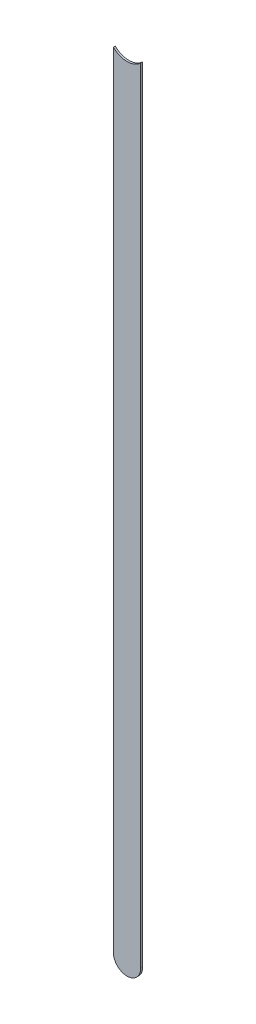
ISO-10303-21;
HEADER;
FILE_DESCRIPTION(('STEP AP214'),'2;1');
FILE_NAME('part.step','',(''),(''),'','','');
FILE_SCHEMA(('AUTOMOTIVE_DESIGN { 1 0 10303 214 1 1 1 1 }'));
ENDSEC;
DATA;
#1=APPLICATION_CONTEXT('core data for automotive mechanical design processes');
#2=APPLICATION_PROTOCOL_DEFINITION('international standard','automotive_design',2000,#1);
#3=PRODUCT_CONTEXT('',#1,'mechanical');
#4=PRODUCT('Part','Part','',(#3));
#5=PRODUCT_RELATED_PRODUCT_CATEGORY('part','',(#4));
#6=PRODUCT_DEFINITION_FORMATION('','',#4);
#7=PRODUCT_DEFINITION_CONTEXT('part definition',#1,'design');
#8=PRODUCT_DEFINITION('design','',#6,#7);
#9=PRODUCT_DEFINITION_SHAPE('','',#8);
#10=(LENGTH_UNIT() NAMED_UNIT(*) SI_UNIT(.MILLI.,.METRE.));
#11=(NAMED_UNIT(*) PLANE_ANGLE_UNIT() SI_UNIT($,.RADIAN.));
#12=(NAMED_UNIT(*) SI_UNIT($,.STERADIAN.) SOLID_ANGLE_UNIT());
#13=UNCERTAINTY_MEASURE_WITH_UNIT(LENGTH_MEASURE(1.E-05),#10,'distance_accuracy_value','');
#14=(GEOMETRIC_REPRESENTATION_CONTEXT(3) GLOBAL_UNCERTAINTY_ASSIGNED_CONTEXT((#13)) GLOBAL_UNIT_ASSIGNED_CONTEXT((#10,
#11,#12)) REPRESENTATION_CONTEXT('',''));
#15=CARTESIAN_POINT('',(0.,0.,0.));
#16=DIRECTION('',(0.,0.,1.));
#17=DIRECTION('',(1.,0.,0.));
#18=AXIS2_PLACEMENT_3D('',#15,#16,#17);
#19=CARTESIAN_POINT('',(57.15,83.4400287,0.));
#20=DIRECTION('',(-1.,0.,0.));
#21=DIRECTION('',(0.,1.,0.));
#22=AXIS2_PLACEMENT_3D('',#19,#20,#21);
#23=PLANE('',#22);
#24=DIRECTION('',(0.,1.,0.));
#25=VECTOR('',#24,1.);
#26=CARTESIAN_POINT('',(57.15,83.4400287,0.03556));
#27=LINE('',#26,#25);
#28=CARTESIAN_POINT('',(57.15,83.4400287,0.03556));
#29=VERTEX_POINT('',#28);
#30=CARTESIAN_POINT('',(57.15,97.7471130244069,0.03556));
#31=VERTEX_POINT('',#30);
#32=EDGE_CURVE('E11',#29,#31,#27,.T.);
#33=ORIENTED_EDGE('',*,*,#32,.F.);
#34=DIRECTION('',(0.,0.,1.));
#35=VECTOR('',#34,1.);
#36=CARTESIAN_POINT('',(57.15,83.4400287,0.));
#37=LINE('',#36,#35);
#38=CARTESIAN_POINT('',(57.15,83.4400287,0.));
#39=VERTEX_POINT('',#38);
#40=EDGE_CURVE('E24',#39,#29,#37,.T.);
#41=ORIENTED_EDGE('',*,*,#40,.F.);
#42=DIRECTION('',(0.,1.,0.));
#43=VECTOR('',#42,1.);
#44=CARTESIAN_POINT('',(57.15,83.4400287,0.));
#45=LINE('',#44,#43);
#46=CARTESIAN_POINT('',(57.15,97.7471130244069,0.));
#47=VERTEX_POINT('',#46);
#48=EDGE_CURVE('E75',#39,#47,#45,.T.);
#49=ORIENTED_EDGE('',*,*,#48,.T.);
#50=DIRECTION('',(0.,0.,1.));
#51=VECTOR('',#50,1.);
#52=CARTESIAN_POINT('',(57.15,97.7471130244069,0.));
#53=LINE('',#52,#51);
#54=EDGE_CURVE('E37',#47,#31,#53,.T.);
#55=ORIENTED_EDGE('',*,*,#54,.T.);
#56=EDGE_LOOP('',(#33,#41,#49,#55));
#57=FACE_BOUND('',#56,.T.);
#58=ADVANCED_FACE('F17',(#57),#23,.F.);
#59=CARTESIAN_POINT('',(56.9000005,97.99999958,0.));
#60=DIRECTION('',(0.,0.,-1.));
#61=DIRECTION('',(1.,0.,0.));
#62=AXIS2_PLACEMENT_3D('',#59,#60,#61);
#63=CYLINDRICAL_SURFACE('',#62,0.3556);
#64=DIRECTION('',(0.,0.,1.));
#65=VECTOR('',#64,1.);
#66=CARTESIAN_POINT('',(56.650001,97.7471130244069,0.));
#67=LINE('',#66,#65);
#68=CARTESIAN_POINT('',(56.650001,97.7471130244069,0.));
#69=VERTEX_POINT('',#68);
#70=CARTESIAN_POINT('',(56.650001,97.7471130244069,0.03556));
#71=VERTEX_POINT('',#70);
#72=EDGE_CURVE('E67',#69,#71,#67,.T.);
#73=ORIENTED_EDGE('',*,*,#72,.T.);
#74=CARTESIAN_POINT('',(56.9000005,97.99999958,0.03556));
#75=DIRECTION('',(0.,0.,1.));
#76=DIRECTION('',(1.,0.,0.));
#77=AXIS2_PLACEMENT_3D('',#74,#75,#76);
#78=CIRCLE('',#77,0.3556);
#79=EDGE_CURVE('E82',#71,#31,#78,.T.);
#80=ORIENTED_EDGE('',*,*,#79,.T.);
#81=ORIENTED_EDGE('',*,*,#54,.F.);
#82=CARTESIAN_POINT('',(56.9000005,97.99999958,0.));
#83=DIRECTION('',(0.,0.,1.));
#84=DIRECTION('',(1.,0.,0.));
#85=AXIS2_PLACEMENT_3D('',#82,#83,#84);
#86=CIRCLE('',#85,0.3556);
#87=EDGE_CURVE('E80',#69,#47,#86,.T.);
#88=ORIENTED_EDGE('',*,*,#87,.F.);
#89=EDGE_LOOP('',(#73,#80,#81,#88));
#90=FACE_BOUND('',#89,.T.);
#91=ADVANCED_FACE('F88',(#90),#63,.F.);
#92=CARTESIAN_POINT('',(56.650001,97.7471130244069,0.));
#93=DIRECTION('',(1.,0.,0.));
#94=DIRECTION('',(0.,-1.,0.));
#95=AXIS2_PLACEMENT_3D('',#92,#93,#94);
#96=PLANE('',#95);
#97=DIRECTION('',(0.,-1.,0.));
#98=VECTOR('',#97,1.);
#99=CARTESIAN_POINT('',(56.650001,97.99999958,0.03556));
#100=LINE('',#99,#98);
#101=CARTESIAN_POINT('',(56.650001,83.4400287,0.03556));
#102=VERTEX_POINT('',#101);
#103=EDGE_CURVE('E71',#71,#102,#100,.T.);
#104=ORIENTED_EDGE('',*,*,#103,.F.);
#105=ORIENTED_EDGE('',*,*,#72,.F.);
#106=DIRECTION('',(0.,-1.,0.));
#107=VECTOR('',#106,1.);
#108=CARTESIAN_POINT('',(56.650001,97.99999958,0.));
#109=LINE('',#108,#107);
#110=CARTESIAN_POINT('',(56.650001,83.4400287,0.));
#111=VERTEX_POINT('',#110);
#112=EDGE_CURVE('E63',#69,#111,#109,.T.);
#113=ORIENTED_EDGE('',*,*,#112,.T.);
#114=DIRECTION('',(0.,0.,1.));
#115=VECTOR('',#114,1.);
#116=CARTESIAN_POINT('',(56.650001,83.4400287,0.));
#117=LINE('',#116,#115);
#118=EDGE_CURVE('E53',#111,#102,#117,.T.);
#119=ORIENTED_EDGE('',*,*,#118,.T.);
#120=EDGE_LOOP('',(#104,#105,#113,#119));
#121=FACE_BOUND('',#120,.T.);
#122=ADVANCED_FACE('F66',(#121),#96,.F.);
#123=CARTESIAN_POINT('',(56.9000005,83.4400287,0.));
#124=DIRECTION('',(0.,0.,-1.));
#125=DIRECTION('',(-1.,0.,0.));
#126=AXIS2_PLACEMENT_3D('',#123,#124,#125);
#127=CYLINDRICAL_SURFACE('',#126,0.249999499999999);
#128=CARTESIAN_POINT('',(56.9000005,83.4400287,0.03556));
#129=DIRECTION('',(0.,0.,1.));
#130=DIRECTION('',(-1.,0.,0.));
#131=AXIS2_PLACEMENT_3D('',#128,#129,#130);
#132=CIRCLE('',#131,0.249999499999999);
#133=EDGE_CURVE('E59',#102,#29,#132,.T.);
#134=ORIENTED_EDGE('',*,*,#133,.F.);
#135=ORIENTED_EDGE('',*,*,#118,.F.);
#136=CARTESIAN_POINT('',(56.9000005,83.4400287,0.));
#137=DIRECTION('',(0.,0.,1.));
#138=DIRECTION('',(-1.,0.,0.));
#139=AXIS2_PLACEMENT_3D('',#136,#137,#138);
#140=CIRCLE('',#139,0.249999499999999);
#141=EDGE_CURVE('E57',#111,#39,#140,.T.);
#142=ORIENTED_EDGE('',*,*,#141,.T.);
#143=ORIENTED_EDGE('',*,*,#40,.T.);
#144=EDGE_LOOP('',(#134,#135,#142,#143));
#145=FACE_BOUND('',#144,.T.);
#146=ADVANCED_FACE('F55',(#145),#127,.T.);
#147=CARTESIAN_POINT('',(57.15,83.4400287,0.));
#148=DIRECTION('',(0.,0.,-1.));
#149=DIRECTION('',(-1.,0.,0.));
#150=AXIS2_PLACEMENT_3D('',#147,#148,#149);
#151=PLANE('',#150);
#152=ORIENTED_EDGE('',*,*,#48,.F.);
#153=ORIENTED_EDGE('',*,*,#141,.F.);
#154=ORIENTED_EDGE('',*,*,#112,.F.);
#155=ORIENTED_EDGE('',*,*,#87,.T.);
#156=EDGE_LOOP('',(#152,#153,#154,#155));
#157=FACE_BOUND('',#156,.T.);
#158=ADVANCED_FACE('F74',(#157),#151,.T.);
#159=CARTESIAN_POINT('',(57.15,83.4400287,0.03556));
#160=DIRECTION('',(0.,0.,-1.));
#161=DIRECTION('',(-1.,0.,0.));
#162=AXIS2_PLACEMENT_3D('',#159,#160,#161);
#163=PLANE('',#162);
#164=ORIENTED_EDGE('',*,*,#133,.T.);
#165=ORIENTED_EDGE('',*,*,#32,.T.);
#166=ORIENTED_EDGE('',*,*,#79,.F.);
#167=ORIENTED_EDGE('',*,*,#103,.T.);
#168=EDGE_LOOP('',(#164,#165,#166,#167));
#169=FACE_BOUND('',#168,.T.);
#170=ADVANCED_FACE('F91',(#169),#163,.F.);
#171=CLOSED_SHELL('',(#58,#91,#122,#146,#158,#170));
#172=MANIFOLD_SOLID_BREP('B1',#171);
#173=ADVANCED_BREP_SHAPE_REPRESENTATION('',(#18,#172),#14);
#174=SHAPE_DEFINITION_REPRESENTATION(#9,#173);
ENDSEC;
END-ISO-10303-21;
